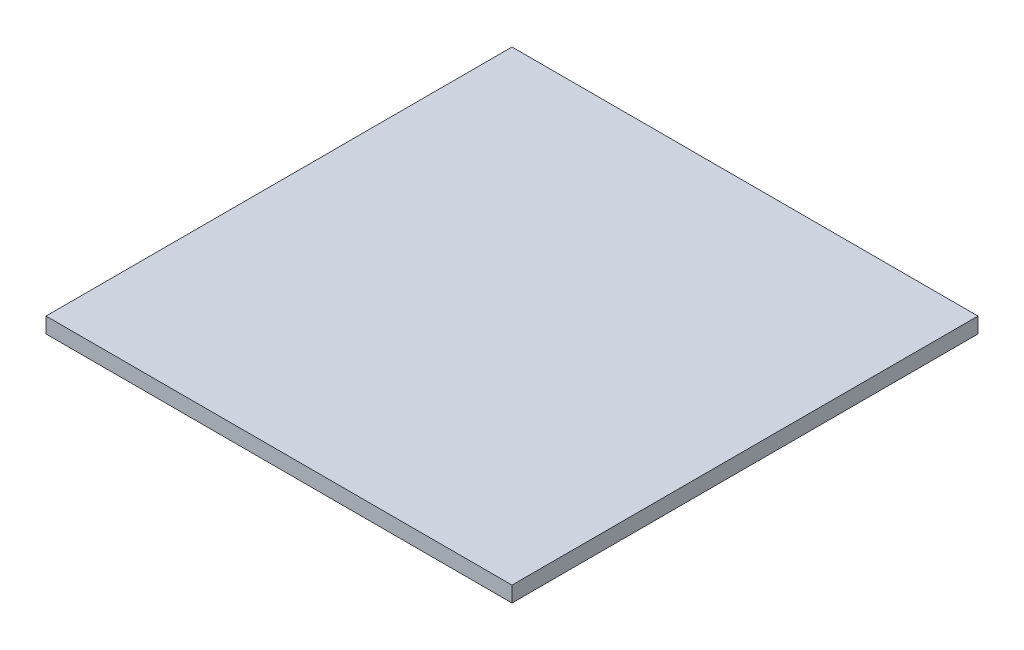
ISO-10303-21;
HEADER;
FILE_DESCRIPTION(('STEP AP214'),'2;1');
FILE_NAME('part.step','',(''),(''),'','','');
FILE_SCHEMA(('AUTOMOTIVE_DESIGN { 1 0 10303 214 1 1 1 1 }'));
ENDSEC;
DATA;
#1=APPLICATION_CONTEXT('core data for automotive mechanical design processes');
#2=APPLICATION_PROTOCOL_DEFINITION('international standard','automotive_design',2000,#1);
#3=PRODUCT_CONTEXT('',#1,'mechanical');
#4=PRODUCT('Part','Part','',(#3));
#5=PRODUCT_RELATED_PRODUCT_CATEGORY('part','',(#4));
#6=PRODUCT_DEFINITION_FORMATION('','',#4);
#7=PRODUCT_DEFINITION_CONTEXT('part definition',#1,'design');
#8=PRODUCT_DEFINITION('design','',#6,#7);
#9=PRODUCT_DEFINITION_SHAPE('','',#8);
#10=(LENGTH_UNIT() NAMED_UNIT(*) SI_UNIT(.MILLI.,.METRE.));
#11=(NAMED_UNIT(*) PLANE_ANGLE_UNIT() SI_UNIT($,.RADIAN.));
#12=(NAMED_UNIT(*) SI_UNIT($,.STERADIAN.) SOLID_ANGLE_UNIT());
#13=UNCERTAINTY_MEASURE_WITH_UNIT(LENGTH_MEASURE(1.E-05),#10,'distance_accuracy_value','');
#14=(GEOMETRIC_REPRESENTATION_CONTEXT(3) GLOBAL_UNCERTAINTY_ASSIGNED_CONTEXT((#13)) GLOBAL_UNIT_ASSIGNED_CONTEXT((#10,
#11,#12)) REPRESENTATION_CONTEXT('',''));
#15=CARTESIAN_POINT('',(0.,0.,0.));
#16=DIRECTION('',(0.,0.,1.));
#17=DIRECTION('',(1.,0.,0.));
#18=AXIS2_PLACEMENT_3D('',#15,#16,#17);
#19=CARTESIAN_POINT('',(30.,1.,-30.));
#20=DIRECTION('',(-1.,0.,0.));
#21=DIRECTION('',(0.,0.,1.));
#22=AXIS2_PLACEMENT_3D('',#19,#20,#21);
#23=PLANE('',#22);
#24=DIRECTION('',(0.,0.,-1.));
#25=VECTOR('',#24,1.);
#26=CARTESIAN_POINT('',(30.,-1.,-30.));
#27=LINE('',#26,#25);
#28=CARTESIAN_POINT('',(30.,-1.,30.));
#29=VERTEX_POINT('',#28);
#30=CARTESIAN_POINT('',(30.,-1.,-30.));
#31=VERTEX_POINT('',#30);
#32=EDGE_CURVE('E96',#29,#31,#27,.T.);
#33=ORIENTED_EDGE('',*,*,#32,.T.);
#34=DIRECTION('',(0.,-1.,0.));
#35=VECTOR('',#34,1.);
#36=CARTESIAN_POINT('',(30.,1.,-30.));
#37=LINE('',#36,#35);
#38=CARTESIAN_POINT('',(30.,1.,-30.));
#39=VERTEX_POINT('',#38);
#40=EDGE_CURVE('E11',#39,#31,#37,.T.);
#41=ORIENTED_EDGE('',*,*,#40,.F.);
#42=DIRECTION('',(0.,0.,-1.));
#43=VECTOR('',#42,1.);
#44=CARTESIAN_POINT('',(30.,1.,-30.));
#45=LINE('',#44,#43);
#46=CARTESIAN_POINT('',(30.,1.,30.));
#47=VERTEX_POINT('',#46);
#48=EDGE_CURVE('E84',#47,#39,#45,.T.);
#49=ORIENTED_EDGE('',*,*,#48,.F.);
#50=DIRECTION('',(0.,-1.,0.));
#51=VECTOR('',#50,1.);
#52=CARTESIAN_POINT('',(30.,1.,30.));
#53=LINE('',#52,#51);
#54=EDGE_CURVE('E92',#47,#29,#53,.T.);
#55=ORIENTED_EDGE('',*,*,#54,.T.);
#56=EDGE_LOOP('',(#33,#41,#49,#55));
#57=FACE_BOUND('',#56,.T.);
#58=ADVANCED_FACE('F33',(#57),#23,.F.);
#59=CARTESIAN_POINT('',(-30.,1.,-30.));
#60=DIRECTION('',(0.,0.,1.));
#61=DIRECTION('',(1.,0.,0.));
#62=AXIS2_PLACEMENT_3D('',#59,#60,#61);
#63=PLANE('',#62);
#64=DIRECTION('',(-1.,0.,0.));
#65=VECTOR('',#64,1.);
#66=CARTESIAN_POINT('',(-30.,-1.,-30.));
#67=LINE('',#66,#65);
#68=CARTESIAN_POINT('',(-30.,-1.,-30.));
#69=VERTEX_POINT('',#68);
#70=EDGE_CURVE('E88',#31,#69,#67,.T.);
#71=ORIENTED_EDGE('',*,*,#70,.T.);
#72=DIRECTION('',(0.,-1.,0.));
#73=VECTOR('',#72,1.);
#74=CARTESIAN_POINT('',(-30.,1.,-30.));
#75=LINE('',#74,#73);
#76=CARTESIAN_POINT('',(-30.,1.,-30.));
#77=VERTEX_POINT('',#76);
#78=EDGE_CURVE('E41',#77,#69,#75,.T.);
#79=ORIENTED_EDGE('',*,*,#78,.F.);
#80=DIRECTION('',(-1.,0.,0.));
#81=VECTOR('',#80,1.);
#82=CARTESIAN_POINT('',(-30.,1.,-30.));
#83=LINE('',#82,#81);
#84=EDGE_CURVE('E79',#39,#77,#83,.T.);
#85=ORIENTED_EDGE('',*,*,#84,.F.);
#86=ORIENTED_EDGE('',*,*,#40,.T.);
#87=EDGE_LOOP('',(#71,#79,#85,#86));
#88=FACE_BOUND('',#87,.T.);
#89=ADVANCED_FACE('F87',(#88),#63,.F.);
#90=CARTESIAN_POINT('',(-30.,1.,-30.));
#91=DIRECTION('',(1.,0.,0.));
#92=DIRECTION('',(0.,0.,-1.));
#93=AXIS2_PLACEMENT_3D('',#90,#91,#92);
#94=PLANE('',#93);
#95=DIRECTION('',(0.,0.,1.));
#96=VECTOR('',#95,1.);
#97=CARTESIAN_POINT('',(-30.,-1.,-30.));
#98=LINE('',#97,#96);
#99=CARTESIAN_POINT('',(-30.,-1.,30.));
#100=VERTEX_POINT('',#99);
#101=EDGE_CURVE('E66',#69,#100,#98,.T.);
#102=ORIENTED_EDGE('',*,*,#101,.T.);
#103=DIRECTION('',(0.,-1.,0.));
#104=VECTOR('',#103,1.);
#105=CARTESIAN_POINT('',(-30.,1.,30.));
#106=LINE('',#105,#104);
#107=CARTESIAN_POINT('',(-30.,1.,30.));
#108=VERTEX_POINT('',#107);
#109=EDGE_CURVE('E89',#108,#100,#106,.T.);
#110=ORIENTED_EDGE('',*,*,#109,.F.);
#111=DIRECTION('',(0.,0.,1.));
#112=VECTOR('',#111,1.);
#113=CARTESIAN_POINT('',(-30.,1.,-30.));
#114=LINE('',#113,#112);
#115=EDGE_CURVE('E82',#77,#108,#114,.T.);
#116=ORIENTED_EDGE('',*,*,#115,.F.);
#117=ORIENTED_EDGE('',*,*,#78,.T.);
#118=EDGE_LOOP('',(#102,#110,#116,#117));
#119=FACE_BOUND('',#118,.T.);
#120=ADVANCED_FACE('F90',(#119),#94,.F.);
#121=CARTESIAN_POINT('',(-30.,1.,30.));
#122=DIRECTION('',(0.,0.,-1.));
#123=DIRECTION('',(-1.,0.,0.));
#124=AXIS2_PLACEMENT_3D('',#121,#122,#123);
#125=PLANE('',#124);
#126=DIRECTION('',(1.,0.,0.));
#127=VECTOR('',#126,1.);
#128=CARTESIAN_POINT('',(-30.,-1.,30.));
#129=LINE('',#128,#127);
#130=EDGE_CURVE('E72',#100,#29,#129,.T.);
#131=ORIENTED_EDGE('',*,*,#130,.T.);
#132=ORIENTED_EDGE('',*,*,#54,.F.);
#133=DIRECTION('',(1.,0.,0.));
#134=VECTOR('',#133,1.);
#135=CARTESIAN_POINT('',(-30.,1.,30.));
#136=LINE('',#135,#134);
#137=EDGE_CURVE('E49',#108,#47,#136,.T.);
#138=ORIENTED_EDGE('',*,*,#137,.F.);
#139=ORIENTED_EDGE('',*,*,#109,.T.);
#140=EDGE_LOOP('',(#131,#132,#138,#139));
#141=FACE_BOUND('',#140,.T.);
#142=ADVANCED_FACE('F103',(#141),#125,.F.);
#143=CARTESIAN_POINT('',(0.,1.,0.));
#144=DIRECTION('',(0.,1.,0.));
#145=DIRECTION('',(0.,0.,1.));
#146=AXIS2_PLACEMENT_3D('',#143,#144,#145);
#147=PLANE('',#146);
#148=ORIENTED_EDGE('',*,*,#48,.T.);
#149=ORIENTED_EDGE('',*,*,#84,.T.);
#150=ORIENTED_EDGE('',*,*,#115,.T.);
#151=ORIENTED_EDGE('',*,*,#137,.T.);
#152=EDGE_LOOP('',(#148,#149,#150,#151));
#153=FACE_BOUND('',#152,.T.);
#154=ADVANCED_FACE('F80',(#153),#147,.T.);
#155=CARTESIAN_POINT('',(0.,-1.,0.));
#156=DIRECTION('',(0.,1.,0.));
#157=DIRECTION('',(0.,0.,1.));
#158=AXIS2_PLACEMENT_3D('',#155,#156,#157);
#159=PLANE('',#158);
#160=ORIENTED_EDGE('',*,*,#32,.F.);
#161=ORIENTED_EDGE('',*,*,#130,.F.);
#162=ORIENTED_EDGE('',*,*,#101,.F.);
#163=ORIENTED_EDGE('',*,*,#70,.F.);
#164=EDGE_LOOP('',(#160,#161,#162,#163));
#165=FACE_BOUND('',#164,.T.);
#166=ADVANCED_FACE('F106',(#165),#159,.F.);
#167=CLOSED_SHELL('',(#58,#89,#120,#142,#154,#166));
#168=MANIFOLD_SOLID_BREP('B2',#167);
#169=ADVANCED_BREP_SHAPE_REPRESENTATION('',(#18,#168),#14);
#170=SHAPE_DEFINITION_REPRESENTATION(#9,#169);
ENDSEC;
END-ISO-10303-21;
